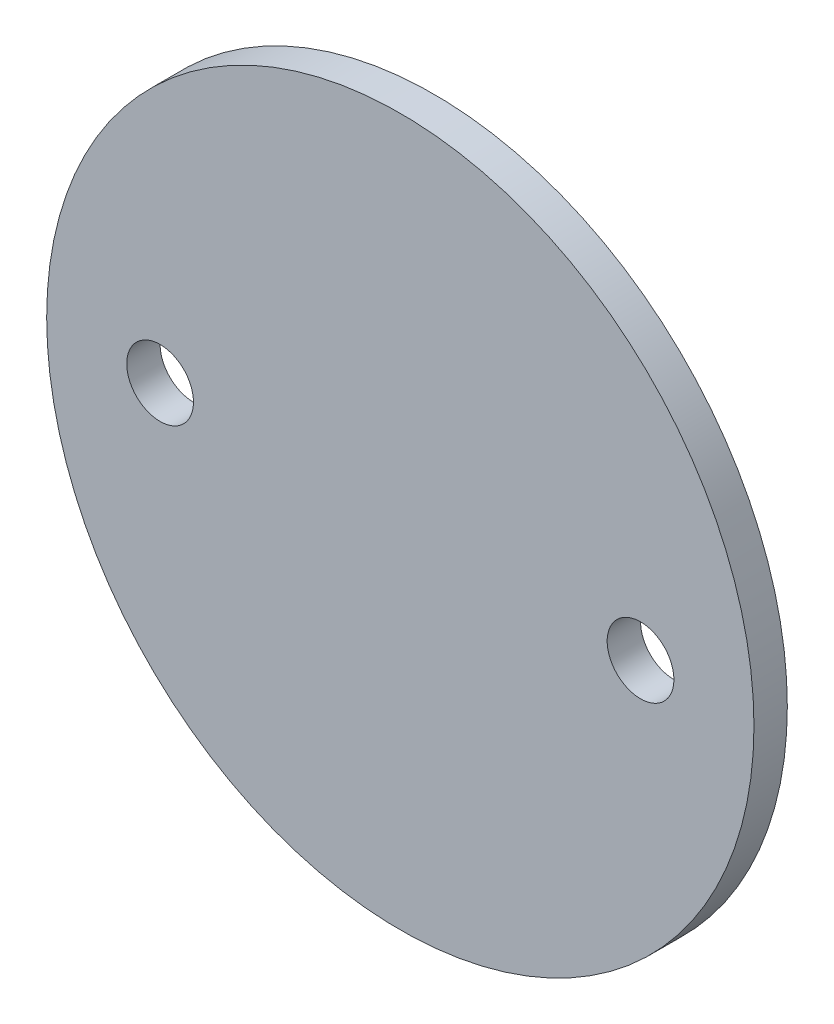
ISO-10303-21;
HEADER;
FILE_DESCRIPTION(('STEP AP214'),'2;1');
FILE_NAME('part.step','',(''),(''),'','','');
FILE_SCHEMA(('AUTOMOTIVE_DESIGN { 1 0 10303 214 1 1 1 1 }'));
ENDSEC;
DATA;
#1=APPLICATION_CONTEXT('core data for automotive mechanical design processes');
#2=APPLICATION_PROTOCOL_DEFINITION('international standard','automotive_design',2000,#1);
#3=PRODUCT_CONTEXT('',#1,'mechanical');
#4=PRODUCT('Part','Part','',(#3));
#5=PRODUCT_RELATED_PRODUCT_CATEGORY('part','',(#4));
#6=PRODUCT_DEFINITION_FORMATION('','',#4);
#7=PRODUCT_DEFINITION_CONTEXT('part definition',#1,'design');
#8=PRODUCT_DEFINITION('design','',#6,#7);
#9=PRODUCT_DEFINITION_SHAPE('','',#8);
#10=(LENGTH_UNIT() NAMED_UNIT(*) SI_UNIT(.MILLI.,.METRE.));
#11=(NAMED_UNIT(*) PLANE_ANGLE_UNIT() SI_UNIT($,.RADIAN.));
#12=(NAMED_UNIT(*) SI_UNIT($,.STERADIAN.) SOLID_ANGLE_UNIT());
#13=UNCERTAINTY_MEASURE_WITH_UNIT(LENGTH_MEASURE(1.E-05),#10,'distance_accuracy_value','');
#14=(GEOMETRIC_REPRESENTATION_CONTEXT(3) GLOBAL_UNCERTAINTY_ASSIGNED_CONTEXT((#13)) GLOBAL_UNIT_ASSIGNED_CONTEXT((#10,
#11,#12)) REPRESENTATION_CONTEXT('',''));
#15=CARTESIAN_POINT('',(0.,0.,0.));
#16=DIRECTION('',(0.,0.,1.));
#17=DIRECTION('',(1.,0.,0.));
#18=AXIS2_PLACEMENT_3D('',#15,#16,#17);
#19=CARTESIAN_POINT('',(0.,0.,2.5));
#20=DIRECTION('',(0.,0.,1.));
#21=DIRECTION('',(1.,0.,0.));
#22=AXIS2_PLACEMENT_3D('',#19,#20,#21);
#23=PLANE('',#22);
#24=CARTESIAN_POINT('',(18.,0.,2.5));
#25=DIRECTION('',(0.,0.,1.));
#26=DIRECTION('',(1.,0.,0.));
#27=AXIS2_PLACEMENT_3D('',#24,#25,#26);
#28=CIRCLE('',#27,2.5);
#29=CARTESIAN_POINT('',(20.5,0.,2.5));
#30=VERTEX_POINT('',#29);
#31=EDGE_CURVE('E52',#30,#30,#28,.T.);
#32=ORIENTED_EDGE('',*,*,#31,.F.);
#33=EDGE_LOOP('',(#32));
#34=FACE_BOUND('',#33,.T.);
#35=CARTESIAN_POINT('',(0.,0.,2.5));
#36=DIRECTION('',(0.,0.,1.));
#37=DIRECTION('',(1.,0.,0.));
#38=AXIS2_PLACEMENT_3D('',#35,#36,#37);
#39=CIRCLE('',#38,26.5);
#40=CARTESIAN_POINT('',(26.5,0.,2.5));
#41=VERTEX_POINT('',#40);
#42=EDGE_CURVE('E10',#41,#41,#39,.T.);
#43=ORIENTED_EDGE('',*,*,#42,.T.);
#44=EDGE_LOOP('',(#43));
#45=FACE_BOUND('',#44,.T.);
#46=CARTESIAN_POINT('',(-18.,0.,2.5));
#47=DIRECTION('',(0.,0.,1.));
#48=DIRECTION('',(1.,0.,0.));
#49=AXIS2_PLACEMENT_3D('',#46,#47,#48);
#50=CIRCLE('',#49,2.5);
#51=CARTESIAN_POINT('',(-15.5,0.,2.5));
#52=VERTEX_POINT('',#51);
#53=EDGE_CURVE('E58',#52,#52,#50,.T.);
#54=ORIENTED_EDGE('',*,*,#53,.F.);
#55=EDGE_LOOP('',(#54));
#56=FACE_BOUND('',#55,.T.);
#57=ADVANCED_FACE('F39',(#34,#45,#56),#23,.T.);
#58=CARTESIAN_POINT('',(0.,0.,0.));
#59=DIRECTION('',(0.,0.,1.));
#60=DIRECTION('',(1.,0.,0.));
#61=AXIS2_PLACEMENT_3D('',#58,#59,#60);
#62=PLANE('',#61);
#63=CARTESIAN_POINT('',(0.,0.,0.));
#64=DIRECTION('',(0.,0.,1.));
#65=DIRECTION('',(1.,0.,0.));
#66=AXIS2_PLACEMENT_3D('',#63,#64,#65);
#67=CIRCLE('',#66,26.5);
#68=CARTESIAN_POINT('',(26.5,0.,0.));
#69=VERTEX_POINT('',#68);
#70=EDGE_CURVE('E43',#69,#69,#67,.T.);
#71=ORIENTED_EDGE('',*,*,#70,.F.);
#72=EDGE_LOOP('',(#71));
#73=FACE_BOUND('',#72,.T.);
#74=CARTESIAN_POINT('',(18.,0.,0.));
#75=DIRECTION('',(0.,0.,1.));
#76=DIRECTION('',(1.,0.,0.));
#77=AXIS2_PLACEMENT_3D('',#74,#75,#76);
#78=CIRCLE('',#77,2.5);
#79=CARTESIAN_POINT('',(20.5,0.,0.));
#80=VERTEX_POINT('',#79);
#81=EDGE_CURVE('E54',#80,#80,#78,.T.);
#82=ORIENTED_EDGE('',*,*,#81,.T.);
#83=EDGE_LOOP('',(#82));
#84=FACE_BOUND('',#83,.T.);
#85=CARTESIAN_POINT('',(-18.,0.,0.));
#86=DIRECTION('',(0.,0.,1.));
#87=DIRECTION('',(1.,0.,0.));
#88=AXIS2_PLACEMENT_3D('',#85,#86,#87);
#89=CIRCLE('',#88,2.5);
#90=CARTESIAN_POINT('',(-15.5,0.,0.));
#91=VERTEX_POINT('',#90);
#92=EDGE_CURVE('E62',#91,#91,#89,.T.);
#93=ORIENTED_EDGE('',*,*,#92,.T.);
#94=EDGE_LOOP('',(#93));
#95=FACE_BOUND('',#94,.T.);
#96=ADVANCED_FACE('F74',(#73,#84,#95),#62,.F.);
#97=CARTESIAN_POINT('',(0.,0.,2.5));
#98=DIRECTION('',(0.,0.,-1.));
#99=DIRECTION('',(-1.,0.,0.));
#100=AXIS2_PLACEMENT_3D('',#97,#98,#99);
#101=CYLINDRICAL_SURFACE('',#100,26.5);
#102=ORIENTED_EDGE('',*,*,#42,.F.);
#103=EDGE_LOOP('',(#102));
#104=FACE_BOUND('',#103,.T.);
#105=ORIENTED_EDGE('',*,*,#70,.T.);
#106=EDGE_LOOP('',(#105));
#107=FACE_BOUND('',#106,.T.);
#108=ADVANCED_FACE('F41',(#104,#107),#101,.T.);
#109=CARTESIAN_POINT('',(18.,0.,2.5));
#110=DIRECTION('',(0.,0.,-1.));
#111=DIRECTION('',(-1.,0.,0.));
#112=AXIS2_PLACEMENT_3D('',#109,#110,#111);
#113=CYLINDRICAL_SURFACE('',#112,2.5);
#114=ORIENTED_EDGE('',*,*,#31,.T.);
#115=EDGE_LOOP('',(#114));
#116=FACE_BOUND('',#115,.T.);
#117=ORIENTED_EDGE('',*,*,#81,.F.);
#118=EDGE_LOOP('',(#117));
#119=FACE_BOUND('',#118,.T.);
#120=ADVANCED_FACE('F83',(#116,#119),#113,.F.);
#121=CARTESIAN_POINT('',(-18.,0.,2.5));
#122=DIRECTION('',(0.,0.,-1.));
#123=DIRECTION('',(-1.,0.,0.));
#124=AXIS2_PLACEMENT_3D('',#121,#122,#123);
#125=CYLINDRICAL_SURFACE('',#124,2.5);
#126=ORIENTED_EDGE('',*,*,#53,.T.);
#127=EDGE_LOOP('',(#126));
#128=FACE_BOUND('',#127,.T.);
#129=ORIENTED_EDGE('',*,*,#92,.F.);
#130=EDGE_LOOP('',(#129));
#131=FACE_BOUND('',#130,.T.);
#132=ADVANCED_FACE('F70',(#128,#131),#125,.F.);
#133=CLOSED_SHELL('',(#57,#96,#108,#120,#132));
#134=MANIFOLD_SOLID_BREP('B2',#133);
#135=ADVANCED_BREP_SHAPE_REPRESENTATION('',(#18,#134),#14);
#136=SHAPE_DEFINITION_REPRESENTATION(#9,#135);
ENDSEC;
END-ISO-10303-21;
